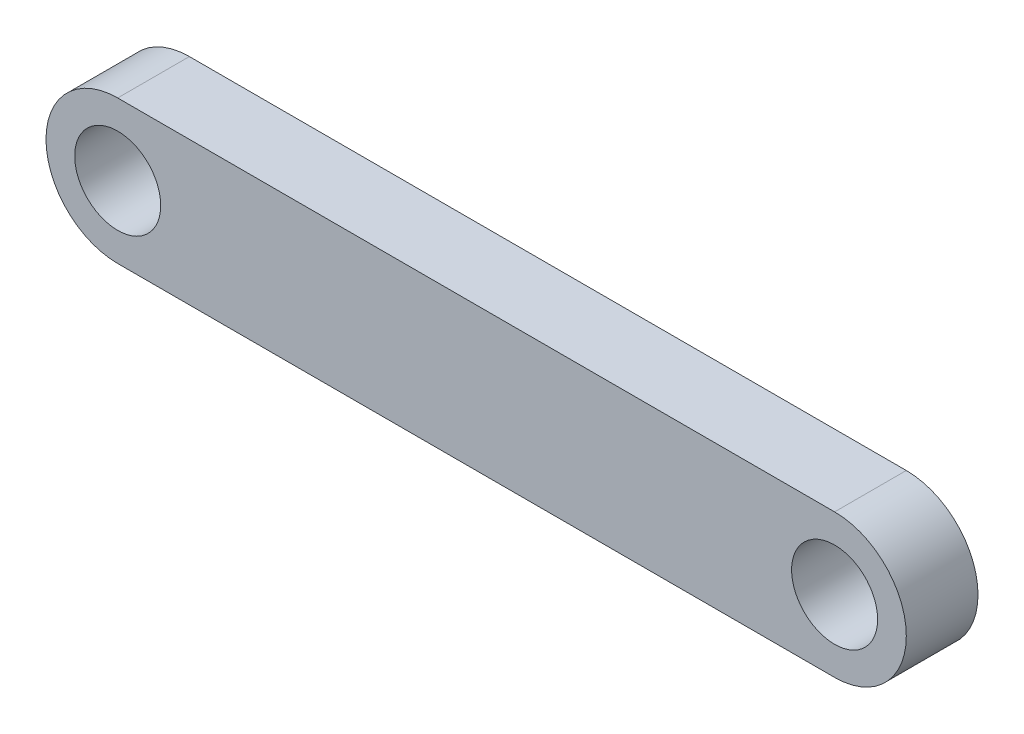
ISO-10303-21;
HEADER;
FILE_DESCRIPTION(('STEP AP214'),'2;1');
FILE_NAME('part.step','',(''),(''),'','','');
FILE_SCHEMA(('AUTOMOTIVE_DESIGN { 1 0 10303 214 1 1 1 1 }'));
ENDSEC;
DATA;
#1=APPLICATION_CONTEXT('core data for automotive mechanical design processes');
#2=APPLICATION_PROTOCOL_DEFINITION('international standard','automotive_design',2000,#1);
#3=PRODUCT_CONTEXT('',#1,'mechanical');
#4=PRODUCT('Part','Part','',(#3));
#5=PRODUCT_RELATED_PRODUCT_CATEGORY('part','',(#4));
#6=PRODUCT_DEFINITION_FORMATION('','',#4);
#7=PRODUCT_DEFINITION_CONTEXT('part definition',#1,'design');
#8=PRODUCT_DEFINITION('design','',#6,#7);
#9=PRODUCT_DEFINITION_SHAPE('','',#8);
#10=(LENGTH_UNIT() NAMED_UNIT(*) SI_UNIT(.MILLI.,.METRE.));
#11=(NAMED_UNIT(*) PLANE_ANGLE_UNIT() SI_UNIT($,.RADIAN.));
#12=(NAMED_UNIT(*) SI_UNIT($,.STERADIAN.) SOLID_ANGLE_UNIT());
#13=UNCERTAINTY_MEASURE_WITH_UNIT(LENGTH_MEASURE(1.E-05),#10,'distance_accuracy_value','');
#14=(GEOMETRIC_REPRESENTATION_CONTEXT(3) GLOBAL_UNCERTAINTY_ASSIGNED_CONTEXT((#13)) GLOBAL_UNIT_ASSIGNED_CONTEXT((#10,
#11,#12)) REPRESENTATION_CONTEXT('',''));
#15=CARTESIAN_POINT('',(0.,0.,0.));
#16=DIRECTION('',(0.,0.,1.));
#17=DIRECTION('',(1.,0.,0.));
#18=AXIS2_PLACEMENT_3D('',#15,#16,#17);
#19=CARTESIAN_POINT('',(25.,0.,5.));
#20=DIRECTION('',(0.,0.,1.));
#21=DIRECTION('',(1.,0.,0.));
#22=AXIS2_PLACEMENT_3D('',#19,#20,#21);
#23=PLANE('',#22);
#24=CARTESIAN_POINT('',(-25.,0.,5.));
#25=DIRECTION('',(0.,0.,1.));
#26=DIRECTION('',(1.,0.,0.));
#27=AXIS2_PLACEMENT_3D('',#24,#25,#26);
#28=CIRCLE('',#27,3.);
#29=CARTESIAN_POINT('',(-22.,0.,5.));
#30=VERTEX_POINT('',#29);
#31=EDGE_CURVE('E99',#30,#30,#28,.T.);
#32=ORIENTED_EDGE('',*,*,#31,.F.);
#33=EDGE_LOOP('',(#32));
#34=FACE_BOUND('',#33,.T.);
#35=CARTESIAN_POINT('',(25.,0.,5.));
#36=DIRECTION('',(0.,0.,1.));
#37=DIRECTION('',(1.,0.,0.));
#38=AXIS2_PLACEMENT_3D('',#35,#36,#37);
#39=CIRCLE('',#38,5.);
#40=CARTESIAN_POINT('',(25.,-4.99999999999999,5.));
#41=VERTEX_POINT('',#40);
#42=CARTESIAN_POINT('',(25.,5.00000000000001,5.));
#43=VERTEX_POINT('',#42);
#44=EDGE_CURVE('E84',#41,#43,#39,.T.);
#45=ORIENTED_EDGE('',*,*,#44,.T.);
#46=DIRECTION('',(-1.,0.,0.));
#47=VECTOR('',#46,1.);
#48=CARTESIAN_POINT('',(25.,5.00000000000001,5.));
#49=LINE('',#48,#47);
#50=CARTESIAN_POINT('',(-25.,5.,5.));
#51=VERTEX_POINT('',#50);
#52=EDGE_CURVE('E79',#43,#51,#49,.T.);
#53=ORIENTED_EDGE('',*,*,#52,.T.);
#54=CARTESIAN_POINT('',(-25.,0.,5.));
#55=DIRECTION('',(0.,0.,1.));
#56=DIRECTION('',(1.,0.,0.));
#57=AXIS2_PLACEMENT_3D('',#54,#55,#56);
#58=CIRCLE('',#57,5.);
#59=CARTESIAN_POINT('',(-25.,-5.00000000000001,5.));
#60=VERTEX_POINT('',#59);
#61=EDGE_CURVE('E82',#51,#60,#58,.T.);
#62=ORIENTED_EDGE('',*,*,#61,.T.);
#63=DIRECTION('',(1.,0.,0.));
#64=VECTOR('',#63,1.);
#65=CARTESIAN_POINT('',(25.,-4.99999999999999,5.));
#66=LINE('',#65,#64);
#67=EDGE_CURVE('E49',#60,#41,#66,.T.);
#68=ORIENTED_EDGE('',*,*,#67,.T.);
#69=EDGE_LOOP('',(#45,#53,#62,#68));
#70=FACE_BOUND('',#69,.T.);
#71=CARTESIAN_POINT('',(25.,0.,5.));
#72=DIRECTION('',(0.,0.,1.));
#73=DIRECTION('',(1.,0.,0.));
#74=AXIS2_PLACEMENT_3D('',#71,#72,#73);
#75=CIRCLE('',#74,3.);
#76=CARTESIAN_POINT('',(28.,0.,5.));
#77=VERTEX_POINT('',#76);
#78=EDGE_CURVE('E114',#77,#77,#75,.T.);
#79=ORIENTED_EDGE('',*,*,#78,.F.);
#80=EDGE_LOOP('',(#79));
#81=FACE_BOUND('',#80,.T.);
#82=ADVANCED_FACE('F32',(#34,#70,#81),#23,.T.);
#83=CARTESIAN_POINT('',(25.,0.,0.));
#84=DIRECTION('',(0.,0.,1.));
#85=DIRECTION('',(1.,0.,0.));
#86=AXIS2_PLACEMENT_3D('',#83,#84,#85);
#87=PLANE('',#86);
#88=CARTESIAN_POINT('',(25.,0.,0.));
#89=DIRECTION('',(0.,0.,1.));
#90=DIRECTION('',(1.,0.,0.));
#91=AXIS2_PLACEMENT_3D('',#88,#89,#90);
#92=CIRCLE('',#91,5.);
#93=CARTESIAN_POINT('',(25.,-4.99999999999999,0.));
#94=VERTEX_POINT('',#93);
#95=CARTESIAN_POINT('',(25.,5.00000000000001,0.));
#96=VERTEX_POINT('',#95);
#97=EDGE_CURVE('E96',#94,#96,#92,.T.);
#98=ORIENTED_EDGE('',*,*,#97,.F.);
#99=DIRECTION('',(1.,0.,0.));
#100=VECTOR('',#99,1.);
#101=CARTESIAN_POINT('',(25.,-4.99999999999999,0.));
#102=LINE('',#101,#100);
#103=CARTESIAN_POINT('',(-25.,-5.00000000000001,0.));
#104=VERTEX_POINT('',#103);
#105=EDGE_CURVE('E72',#104,#94,#102,.T.);
#106=ORIENTED_EDGE('',*,*,#105,.F.);
#107=CARTESIAN_POINT('',(-25.,0.,0.));
#108=DIRECTION('',(0.,0.,1.));
#109=DIRECTION('',(1.,0.,0.));
#110=AXIS2_PLACEMENT_3D('',#107,#108,#109);
#111=CIRCLE('',#110,5.);
#112=CARTESIAN_POINT('',(-25.,5.,0.));
#113=VERTEX_POINT('',#112);
#114=EDGE_CURVE('E66',#113,#104,#111,.T.);
#115=ORIENTED_EDGE('',*,*,#114,.F.);
#116=DIRECTION('',(-1.,0.,0.));
#117=VECTOR('',#116,1.);
#118=CARTESIAN_POINT('',(25.,5.00000000000001,0.));
#119=LINE('',#118,#117);
#120=EDGE_CURVE('E88',#96,#113,#119,.T.);
#121=ORIENTED_EDGE('',*,*,#120,.F.);
#122=EDGE_LOOP('',(#98,#106,#115,#121));
#123=FACE_BOUND('',#122,.T.);
#124=CARTESIAN_POINT('',(-25.,0.,0.));
#125=DIRECTION('',(0.,0.,1.));
#126=DIRECTION('',(1.,0.,0.));
#127=AXIS2_PLACEMENT_3D('',#124,#125,#126);
#128=CIRCLE('',#127,3.);
#129=CARTESIAN_POINT('',(-22.,0.,0.));
#130=VERTEX_POINT('',#129);
#131=EDGE_CURVE('E111',#130,#130,#128,.T.);
#132=ORIENTED_EDGE('',*,*,#131,.T.);
#133=EDGE_LOOP('',(#132));
#134=FACE_BOUND('',#133,.T.);
#135=CARTESIAN_POINT('',(25.,0.,0.));
#136=DIRECTION('',(0.,0.,1.));
#137=DIRECTION('',(1.,0.,0.));
#138=AXIS2_PLACEMENT_3D('',#135,#136,#137);
#139=CIRCLE('',#138,3.);
#140=CARTESIAN_POINT('',(28.,0.,0.));
#141=VERTEX_POINT('',#140);
#142=EDGE_CURVE('E117',#141,#141,#139,.T.);
#143=ORIENTED_EDGE('',*,*,#142,.T.);
#144=EDGE_LOOP('',(#143));
#145=FACE_BOUND('',#144,.T.);
#146=ADVANCED_FACE('F107',(#123,#134,#145),#87,.F.);
#147=CARTESIAN_POINT('',(25.,0.,5.));
#148=DIRECTION('',(0.,0.,-1.));
#149=DIRECTION('',(-1.,0.,0.));
#150=AXIS2_PLACEMENT_3D('',#147,#148,#149);
#151=CYLINDRICAL_SURFACE('',#150,5.);
#152=ORIENTED_EDGE('',*,*,#97,.T.);
#153=DIRECTION('',(0.,0.,-1.));
#154=VECTOR('',#153,1.);
#155=CARTESIAN_POINT('',(25.,5.00000000000001,5.));
#156=LINE('',#155,#154);
#157=EDGE_CURVE('E11',#43,#96,#156,.T.);
#158=ORIENTED_EDGE('',*,*,#157,.F.);
#159=ORIENTED_EDGE('',*,*,#44,.F.);
#160=DIRECTION('',(0.,0.,-1.));
#161=VECTOR('',#160,1.);
#162=CARTESIAN_POINT('',(25.,-4.99999999999999,5.));
#163=LINE('',#162,#161);
#164=EDGE_CURVE('E92',#41,#94,#163,.T.);
#165=ORIENTED_EDGE('',*,*,#164,.T.);
#166=EDGE_LOOP('',(#152,#158,#159,#165));
#167=FACE_BOUND('',#166,.T.);
#168=ADVANCED_FACE('F34',(#167),#151,.T.);
#169=CARTESIAN_POINT('',(25.,5.00000000000001,5.));
#170=DIRECTION('',(0.,-1.,0.));
#171=DIRECTION('',(1.,0.,0.));
#172=AXIS2_PLACEMENT_3D('',#169,#170,#171);
#173=PLANE('',#172);
#174=ORIENTED_EDGE('',*,*,#120,.T.);
#175=DIRECTION('',(0.,0.,-1.));
#176=VECTOR('',#175,1.);
#177=CARTESIAN_POINT('',(-25.,5.,5.));
#178=LINE('',#177,#176);
#179=EDGE_CURVE('E41',#51,#113,#178,.T.);
#180=ORIENTED_EDGE('',*,*,#179,.F.);
#181=ORIENTED_EDGE('',*,*,#52,.F.);
#182=ORIENTED_EDGE('',*,*,#157,.T.);
#183=EDGE_LOOP('',(#174,#180,#181,#182));
#184=FACE_BOUND('',#183,.T.);
#185=ADVANCED_FACE('F87',(#184),#173,.F.);
#186=CARTESIAN_POINT('',(-25.,0.,5.));
#187=DIRECTION('',(0.,0.,-1.));
#188=DIRECTION('',(-1.,0.,0.));
#189=AXIS2_PLACEMENT_3D('',#186,#187,#188);
#190=CYLINDRICAL_SURFACE('',#189,5.);
#191=ORIENTED_EDGE('',*,*,#114,.T.);
#192=DIRECTION('',(0.,0.,-1.));
#193=VECTOR('',#192,1.);
#194=CARTESIAN_POINT('',(-25.,-5.00000000000001,5.));
#195=LINE('',#194,#193);
#196=EDGE_CURVE('E89',#60,#104,#195,.T.);
#197=ORIENTED_EDGE('',*,*,#196,.F.);
#198=ORIENTED_EDGE('',*,*,#61,.F.);
#199=ORIENTED_EDGE('',*,*,#179,.T.);
#200=EDGE_LOOP('',(#191,#197,#198,#199));
#201=FACE_BOUND('',#200,.T.);
#202=ADVANCED_FACE('F90',(#201),#190,.T.);
#203=CARTESIAN_POINT('',(25.,-4.99999999999999,5.));
#204=DIRECTION('',(0.,1.,0.));
#205=DIRECTION('',(-1.,0.,0.));
#206=AXIS2_PLACEMENT_3D('',#203,#204,#205);
#207=PLANE('',#206);
#208=ORIENTED_EDGE('',*,*,#105,.T.);
#209=ORIENTED_EDGE('',*,*,#164,.F.);
#210=ORIENTED_EDGE('',*,*,#67,.F.);
#211=ORIENTED_EDGE('',*,*,#196,.T.);
#212=EDGE_LOOP('',(#208,#209,#210,#211));
#213=FACE_BOUND('',#212,.T.);
#214=ADVANCED_FACE('F104',(#213),#207,.F.);
#215=CARTESIAN_POINT('',(-25.,0.,5.));
#216=DIRECTION('',(0.,0.,-1.));
#217=DIRECTION('',(-1.,0.,0.));
#218=AXIS2_PLACEMENT_3D('',#215,#216,#217);
#219=CYLINDRICAL_SURFACE('',#218,3.);
#220=ORIENTED_EDGE('',*,*,#31,.T.);
#221=EDGE_LOOP('',(#220));
#222=FACE_BOUND('',#221,.T.);
#223=ORIENTED_EDGE('',*,*,#131,.F.);
#224=EDGE_LOOP('',(#223));
#225=FACE_BOUND('',#224,.T.);
#226=ADVANCED_FACE('F134',(#222,#225),#219,.F.);
#227=CARTESIAN_POINT('',(25.,0.,5.));
#228=DIRECTION('',(0.,0.,-1.));
#229=DIRECTION('',(-1.,0.,0.));
#230=AXIS2_PLACEMENT_3D('',#227,#228,#229);
#231=CYLINDRICAL_SURFACE('',#230,3.);
#232=ORIENTED_EDGE('',*,*,#78,.T.);
#233=EDGE_LOOP('',(#232));
#234=FACE_BOUND('',#233,.T.);
#235=ORIENTED_EDGE('',*,*,#142,.F.);
#236=EDGE_LOOP('',(#235));
#237=FACE_BOUND('',#236,.T.);
#238=ADVANCED_FACE('F123',(#234,#237),#231,.F.);
#239=CLOSED_SHELL('',(#82,#146,#168,#185,#202,#214,#226,#238));
#240=MANIFOLD_SOLID_BREP('B2',#239);
#241=ADVANCED_BREP_SHAPE_REPRESENTATION('',(#18,#240),#14);
#242=SHAPE_DEFINITION_REPRESENTATION(#9,#241);
ENDSEC;
END-ISO-10303-21;
